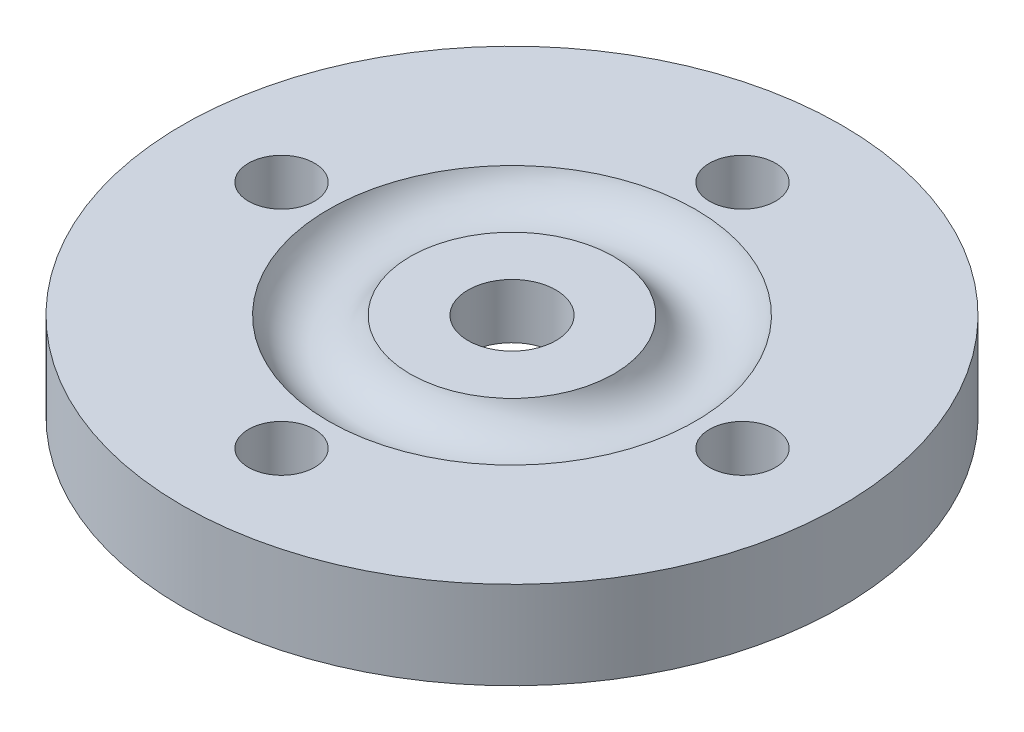
ISO-10303-21;
HEADER;
FILE_DESCRIPTION(('STEP AP214'),'2;1');
FILE_NAME('part.step','',(''),(''),'','','');
FILE_SCHEMA(('AUTOMOTIVE_DESIGN { 1 0 10303 214 1 1 1 1 }'));
ENDSEC;
DATA;
#1=APPLICATION_CONTEXT('core data for automotive mechanical design processes');
#2=APPLICATION_PROTOCOL_DEFINITION('international standard','automotive_design',2000,#1);
#3=PRODUCT_CONTEXT('',#1,'mechanical');
#4=PRODUCT('Part','Part','',(#3));
#5=PRODUCT_RELATED_PRODUCT_CATEGORY('part','',(#4));
#6=PRODUCT_DEFINITION_FORMATION('','',#4);
#7=PRODUCT_DEFINITION_CONTEXT('part definition',#1,'design');
#8=PRODUCT_DEFINITION('design','',#6,#7);
#9=PRODUCT_DEFINITION_SHAPE('','',#8);
#10=(LENGTH_UNIT() NAMED_UNIT(*) SI_UNIT(.MILLI.,.METRE.));
#11=(NAMED_UNIT(*) PLANE_ANGLE_UNIT() SI_UNIT($,.RADIAN.));
#12=(NAMED_UNIT(*) SI_UNIT($,.STERADIAN.) SOLID_ANGLE_UNIT());
#13=UNCERTAINTY_MEASURE_WITH_UNIT(LENGTH_MEASURE(1.E-05),#10,'distance_accuracy_value','');
#14=(GEOMETRIC_REPRESENTATION_CONTEXT(3) GLOBAL_UNCERTAINTY_ASSIGNED_CONTEXT((#13)) GLOBAL_UNIT_ASSIGNED_CONTEXT((#10,
#11,#12)) REPRESENTATION_CONTEXT('',''));
#15=CARTESIAN_POINT('',(0.,0.,0.));
#16=DIRECTION('',(0.,0.,1.));
#17=DIRECTION('',(1.,0.,0.));
#18=AXIS2_PLACEMENT_3D('',#15,#16,#17);
#19=CARTESIAN_POINT('',(-26.3491413562373,0.,0.));
#20=DIRECTION('',(0.,1.,0.));
#21=DIRECTION('',(0.,0.,1.));
#22=AXIS2_PLACEMENT_3D('',#19,#20,#21);
#23=PLANE('',#22);
#24=CARTESIAN_POINT('',(0.,0.,0.));
#25=DIRECTION('',(0.,1.,0.));
#26=DIRECTION('',(0.,0.,1.));
#27=AXIS2_PLACEMENT_3D('',#24,#25,#26);
#28=CIRCLE('',#27,11.9126);
#29=CARTESIAN_POINT('',(0.,0.,11.9126));
#30=VERTEX_POINT('',#29);
#31=EDGE_CURVE('E78',#30,#30,#28,.T.);
#32=ORIENTED_EDGE('',*,*,#31,.T.);
#33=EDGE_LOOP('',(#32));
#34=FACE_BOUND('',#33,.T.);
#35=CARTESIAN_POINT('',(0.,0.,-8.3312));
#36=DIRECTION('',(0.,1.,0.));
#37=DIRECTION('',(0.,0.,1.));
#38=AXIS2_PLACEMENT_3D('',#35,#36,#37);
#39=CIRCLE('',#38,1.1938);
#40=CARTESIAN_POINT('',(0.,0.,-7.1374));
#41=VERTEX_POINT('',#40);
#42=EDGE_CURVE('E75',#41,#41,#39,.T.);
#43=ORIENTED_EDGE('',*,*,#42,.F.);
#44=EDGE_LOOP('',(#43));
#45=FACE_BOUND('',#44,.T.);
#46=CARTESIAN_POINT('',(8.3312,0.,0.));
#47=DIRECTION('',(0.,1.,0.));
#48=DIRECTION('',(0.,0.,1.));
#49=AXIS2_PLACEMENT_3D('',#46,#47,#48);
#50=CIRCLE('',#49,1.1938);
#51=CARTESIAN_POINT('',(8.3312,0.,1.1938));
#52=VERTEX_POINT('',#51);
#53=EDGE_CURVE('E72',#52,#52,#50,.T.);
#54=ORIENTED_EDGE('',*,*,#53,.F.);
#55=EDGE_LOOP('',(#54));
#56=FACE_BOUND('',#55,.T.);
#57=CARTESIAN_POINT('',(0.,0.,8.3312));
#58=DIRECTION('',(0.,1.,0.));
#59=DIRECTION('',(0.,0.,1.));
#60=AXIS2_PLACEMENT_3D('',#57,#58,#59);
#61=CIRCLE('',#60,1.1938);
#62=CARTESIAN_POINT('',(0.,0.,9.525));
#63=VERTEX_POINT('',#62);
#64=EDGE_CURVE('E69',#63,#63,#61,.T.);
#65=ORIENTED_EDGE('',*,*,#64,.F.);
#66=EDGE_LOOP('',(#65));
#67=FACE_BOUND('',#66,.T.);
#68=CARTESIAN_POINT('',(-8.3312,0.,0.));
#69=DIRECTION('',(0.,1.,0.));
#70=DIRECTION('',(0.,0.,1.));
#71=AXIS2_PLACEMENT_3D('',#68,#69,#70);
#72=CIRCLE('',#71,1.1938);
#73=CARTESIAN_POINT('',(-8.3312,0.,1.1938));
#74=VERTEX_POINT('',#73);
#75=EDGE_CURVE('E54',#74,#74,#72,.T.);
#76=ORIENTED_EDGE('',*,*,#75,.F.);
#77=EDGE_LOOP('',(#76));
#78=FACE_BOUND('',#77,.T.);
#79=CARTESIAN_POINT('',(0.,0.,0.));
#80=DIRECTION('',(0.,1.,0.));
#81=DIRECTION('',(0.,0.,1.));
#82=AXIS2_PLACEMENT_3D('',#79,#80,#81);
#83=CIRCLE('',#82,6.63229844183916);
#84=CARTESIAN_POINT('',(0.,0.,6.63229844183916));
#85=VERTEX_POINT('',#84);
#86=EDGE_CURVE('E51',#85,#85,#83,.F.);
#87=ORIENTED_EDGE('',*,*,#86,.T.);
#88=EDGE_LOOP('',(#87));
#89=FACE_BOUND('',#88,.T.);
#90=ADVANCED_FACE('F31',(#34,#45,#56,#67,#78,#89),#23,.T.);
#91=CARTESIAN_POINT('',(0.,-3.175,-8.3312));
#92=DIRECTION('',(0.,1.,0.));
#93=DIRECTION('',(0.,0.,1.));
#94=AXIS2_PLACEMENT_3D('',#91,#92,#93);
#95=CYLINDRICAL_SURFACE('',#94,1.1938);
#96=CARTESIAN_POINT('',(0.,-3.175,-8.3312));
#97=DIRECTION('',(0.,1.,0.));
#98=DIRECTION('',(0.,0.,1.));
#99=AXIS2_PLACEMENT_3D('',#96,#97,#98);
#100=CIRCLE('',#99,1.1938);
#101=CARTESIAN_POINT('',(0.,-3.175,-7.1374));
#102=VERTEX_POINT('',#101);
#103=EDGE_CURVE('E39',#102,#102,#100,.T.);
#104=ORIENTED_EDGE('',*,*,#103,.F.);
#105=EDGE_LOOP('',(#104));
#106=FACE_BOUND('',#105,.T.);
#107=ORIENTED_EDGE('',*,*,#42,.T.);
#108=EDGE_LOOP('',(#107));
#109=FACE_BOUND('',#108,.T.);
#110=ADVANCED_FACE('F96',(#106,#109),#95,.F.);
#111=CARTESIAN_POINT('',(8.3312,-3.175,0.));
#112=DIRECTION('',(0.,1.,0.));
#113=DIRECTION('',(0.,0.,1.));
#114=AXIS2_PLACEMENT_3D('',#111,#112,#113);
#115=CYLINDRICAL_SURFACE('',#114,1.1938);
#116=CARTESIAN_POINT('',(8.3312,-3.175,0.));
#117=DIRECTION('',(0.,1.,0.));
#118=DIRECTION('',(0.,0.,1.));
#119=AXIS2_PLACEMENT_3D('',#116,#117,#118);
#120=CIRCLE('',#119,1.1938);
#121=CARTESIAN_POINT('',(8.3312,-3.175,1.1938));
#122=VERTEX_POINT('',#121);
#123=EDGE_CURVE('E44',#122,#122,#120,.T.);
#124=ORIENTED_EDGE('',*,*,#123,.F.);
#125=EDGE_LOOP('',(#124));
#126=FACE_BOUND('',#125,.T.);
#127=ORIENTED_EDGE('',*,*,#53,.T.);
#128=EDGE_LOOP('',(#127));
#129=FACE_BOUND('',#128,.T.);
#130=ADVANCED_FACE('F92',(#126,#129),#115,.F.);
#131=CARTESIAN_POINT('',(0.,-3.175,8.3312));
#132=DIRECTION('',(0.,1.,0.));
#133=DIRECTION('',(0.,0.,1.));
#134=AXIS2_PLACEMENT_3D('',#131,#132,#133);
#135=CYLINDRICAL_SURFACE('',#134,1.1938);
#136=CARTESIAN_POINT('',(0.,-3.175,8.3312));
#137=DIRECTION('',(0.,1.,0.));
#138=DIRECTION('',(0.,0.,1.));
#139=AXIS2_PLACEMENT_3D('',#136,#137,#138);
#140=CIRCLE('',#139,1.1938);
#141=CARTESIAN_POINT('',(0.,-3.175,9.525));
#142=VERTEX_POINT('',#141);
#143=EDGE_CURVE('E84',#142,#142,#140,.T.);
#144=ORIENTED_EDGE('',*,*,#143,.F.);
#145=EDGE_LOOP('',(#144));
#146=FACE_BOUND('',#145,.T.);
#147=ORIENTED_EDGE('',*,*,#64,.T.);
#148=EDGE_LOOP('',(#147));
#149=FACE_BOUND('',#148,.T.);
#150=ADVANCED_FACE('F95',(#146,#149),#135,.F.);
#151=CARTESIAN_POINT('',(-8.3312,-3.175,0.));
#152=DIRECTION('',(0.,1.,0.));
#153=DIRECTION('',(0.,0.,1.));
#154=AXIS2_PLACEMENT_3D('',#151,#152,#153);
#155=CYLINDRICAL_SURFACE('',#154,1.1938);
#156=CARTESIAN_POINT('',(-8.3312,-3.175,0.));
#157=DIRECTION('',(0.,1.,0.));
#158=DIRECTION('',(0.,0.,1.));
#159=AXIS2_PLACEMENT_3D('',#156,#157,#158);
#160=CIRCLE('',#159,1.1938);
#161=CARTESIAN_POINT('',(-8.3312,-3.175,1.1938));
#162=VERTEX_POINT('',#161);
#163=EDGE_CURVE('E81',#162,#162,#160,.T.);
#164=ORIENTED_EDGE('',*,*,#163,.F.);
#165=EDGE_LOOP('',(#164));
#166=FACE_BOUND('',#165,.T.);
#167=ORIENTED_EDGE('',*,*,#75,.T.);
#168=EDGE_LOOP('',(#167));
#169=FACE_BOUND('',#168,.T.);
#170=ADVANCED_FACE('F33',(#166,#169),#155,.F.);
#171=CARTESIAN_POINT('',(0.,-3.175,0.));
#172=DIRECTION('',(0.,1.,0.));
#173=DIRECTION('',(0.,0.,1.));
#174=AXIS2_PLACEMENT_3D('',#171,#172,#173);
#175=CYLINDRICAL_SURFACE('',#174,11.9126);
#176=CARTESIAN_POINT('',(0.,-3.175,0.));
#177=DIRECTION('',(0.,1.,0.));
#178=DIRECTION('',(0.,0.,1.));
#179=AXIS2_PLACEMENT_3D('',#176,#177,#178);
#180=CIRCLE('',#179,11.9126);
#181=CARTESIAN_POINT('',(0.,-3.175,11.9126));
#182=VERTEX_POINT('',#181);
#183=EDGE_CURVE('E10',#182,#182,#180,.T.);
#184=ORIENTED_EDGE('',*,*,#183,.T.);
#185=EDGE_LOOP('',(#184));
#186=FACE_BOUND('',#185,.T.);
#187=ORIENTED_EDGE('',*,*,#31,.F.);
#188=EDGE_LOOP('',(#187));
#189=FACE_BOUND('',#188,.T.);
#190=ADVANCED_FACE('F129',(#186,#189),#175,.T.);
#191=CARTESIAN_POINT('',(-26.3491413562373,-3.175,0.));
#192=DIRECTION('',(0.,1.,0.));
#193=DIRECTION('',(0.,0.,1.));
#194=AXIS2_PLACEMENT_3D('',#191,#192,#193);
#195=PLANE('',#194);
#196=CARTESIAN_POINT('',(0.,-3.175,0.));
#197=DIRECTION('',(0.,1.,0.));
#198=DIRECTION('',(0.,0.,1.));
#199=AXIS2_PLACEMENT_3D('',#196,#197,#198);
#200=CIRCLE('',#199,3.5687);
#201=CARTESIAN_POINT('',(0.,-3.175,3.5687));
#202=VERTEX_POINT('',#201);
#203=EDGE_CURVE('E52',#202,#202,#200,.T.);
#204=ORIENTED_EDGE('',*,*,#203,.T.);
#205=EDGE_LOOP('',(#204));
#206=FACE_BOUND('',#205,.T.);
#207=ORIENTED_EDGE('',*,*,#163,.T.);
#208=EDGE_LOOP('',(#207));
#209=FACE_BOUND('',#208,.T.);
#210=ORIENTED_EDGE('',*,*,#143,.T.);
#211=EDGE_LOOP('',(#210));
#212=FACE_BOUND('',#211,.T.);
#213=ORIENTED_EDGE('',*,*,#123,.T.);
#214=EDGE_LOOP('',(#213));
#215=FACE_BOUND('',#214,.T.);
#216=ORIENTED_EDGE('',*,*,#103,.T.);
#217=EDGE_LOOP('',(#216));
#218=FACE_BOUND('',#217,.T.);
#219=ORIENTED_EDGE('',*,*,#183,.F.);
#220=EDGE_LOOP('',(#219));
#221=FACE_BOUND('',#220,.T.);
#222=ADVANCED_FACE('F89',(#206,#209,#212,#215,#218,#221),#195,.F.);
#223=CARTESIAN_POINT('',(0.,0.584199999999999,0.));
#224=DIRECTION('',(0.,1.,0.));
#225=DIRECTION('',(0.,0.,1.));
#226=AXIS2_PLACEMENT_3D('',#223,#224,#225);
#227=TOROIDAL_SURFACE('',#226,5.1562,1.5875);
#228=ORIENTED_EDGE('',*,*,#86,.F.);
#229=EDGE_LOOP('',(#228));
#230=FACE_BOUND('',#229,.T.);
#231=CARTESIAN_POINT('',(0.,0.,0.));
#232=DIRECTION('',(0.,-1.,0.));
#233=DIRECTION('',(0.,0.,-1.));
#234=AXIS2_PLACEMENT_3D('',#231,#232,#233);
#235=CIRCLE('',#234,3.68010155816084);
#236=CARTESIAN_POINT('',(0.,0.,-3.68010155816084));
#237=VERTEX_POINT('',#236);
#238=EDGE_CURVE('E48',#237,#237,#235,.F.);
#239=ORIENTED_EDGE('',*,*,#238,.F.);
#240=EDGE_LOOP('',(#239));
#241=FACE_BOUND('',#240,.T.);
#242=ADVANCED_FACE('F111',(#230,#241),#227,.F.);
#243=CARTESIAN_POINT('',(0.,0.,0.));
#244=DIRECTION('',(0.,1.,0.));
#245=DIRECTION('',(0.,0.,1.));
#246=AXIS2_PLACEMENT_3D('',#243,#244,#245);
#247=CIRCLE('',#246,1.5875);
#248=CARTESIAN_POINT('',(0.,0.,1.5875));
#249=VERTEX_POINT('',#248);
#250=EDGE_CURVE('E64',#249,#249,#247,.T.);
#251=ORIENTED_EDGE('',*,*,#250,.F.);
#252=EDGE_LOOP('',(#251));
#253=FACE_BOUND('',#252,.T.);
#254=ORIENTED_EDGE('',*,*,#238,.T.);
#255=EDGE_LOOP('',(#254));
#256=FACE_BOUND('',#255,.T.);
#257=ADVANCED_FACE('F104',(#253,#256),#23,.T.);
#258=CARTESIAN_POINT('',(0.,-5.1562,0.));
#259=DIRECTION('',(0.,1.,0.));
#260=DIRECTION('',(0.,0.,1.));
#261=AXIS2_PLACEMENT_3D('',#258,#259,#260);
#262=CYLINDRICAL_SURFACE('',#261,3.5687);
#263=CARTESIAN_POINT('',(0.,-1.9812,0.));
#264=DIRECTION('',(0.,1.,0.));
#265=DIRECTION('',(0.,0.,1.));
#266=AXIS2_PLACEMENT_3D('',#263,#264,#265);
#267=CIRCLE('',#266,3.5687);
#268=CARTESIAN_POINT('',(0.,-1.9812,3.5687));
#269=VERTEX_POINT('',#268);
#270=EDGE_CURVE('E56',#269,#269,#267,.T.);
#271=ORIENTED_EDGE('',*,*,#270,.T.);
#272=EDGE_LOOP('',(#271));
#273=FACE_BOUND('',#272,.T.);
#274=ORIENTED_EDGE('',*,*,#203,.F.);
#275=EDGE_LOOP('',(#274));
#276=FACE_BOUND('',#275,.T.);
#277=ADVANCED_FACE('F118',(#273,#276),#262,.F.);
#278=CARTESIAN_POINT('',(-26.3491413562373,-1.9812,0.));
#279=DIRECTION('',(0.,1.,0.));
#280=DIRECTION('',(0.,0.,1.));
#281=AXIS2_PLACEMENT_3D('',#278,#279,#280);
#282=PLANE('',#281);
#283=CARTESIAN_POINT('',(0.,-1.9812,0.));
#284=DIRECTION('',(0.,1.,0.));
#285=DIRECTION('',(0.,0.,1.));
#286=AXIS2_PLACEMENT_3D('',#283,#284,#285);
#287=CIRCLE('',#286,1.5875);
#288=CARTESIAN_POINT('',(0.,-1.9812,1.5875));
#289=VERTEX_POINT('',#288);
#290=EDGE_CURVE('E35',#289,#289,#287,.T.);
#291=ORIENTED_EDGE('',*,*,#290,.T.);
#292=EDGE_LOOP('',(#291));
#293=FACE_BOUND('',#292,.T.);
#294=ORIENTED_EDGE('',*,*,#270,.F.);
#295=EDGE_LOOP('',(#294));
#296=FACE_BOUND('',#295,.T.);
#297=ADVANCED_FACE('F123',(#293,#296),#282,.F.);
#298=CARTESIAN_POINT('',(0.,-3.175,0.));
#299=DIRECTION('',(0.,1.,0.));
#300=DIRECTION('',(0.,0.,1.));
#301=AXIS2_PLACEMENT_3D('',#298,#299,#300);
#302=CYLINDRICAL_SURFACE('',#301,1.5875);
#303=ORIENTED_EDGE('',*,*,#250,.T.);
#304=EDGE_LOOP('',(#303));
#305=FACE_BOUND('',#304,.T.);
#306=ORIENTED_EDGE('',*,*,#290,.F.);
#307=EDGE_LOOP('',(#306));
#308=FACE_BOUND('',#307,.T.);
#309=ADVANCED_FACE('F202',(#305,#308),#302,.F.);
#310=CLOSED_SHELL('',(#90,#110,#130,#150,#170,#190,#222,#242,#257,#277,#297,#309));
#311=MANIFOLD_SOLID_BREP('B2',#310);
#312=ADVANCED_BREP_SHAPE_REPRESENTATION('',(#18,#311),#14);
#313=SHAPE_DEFINITION_REPRESENTATION(#9,#312);
ENDSEC;
END-ISO-10303-21;
